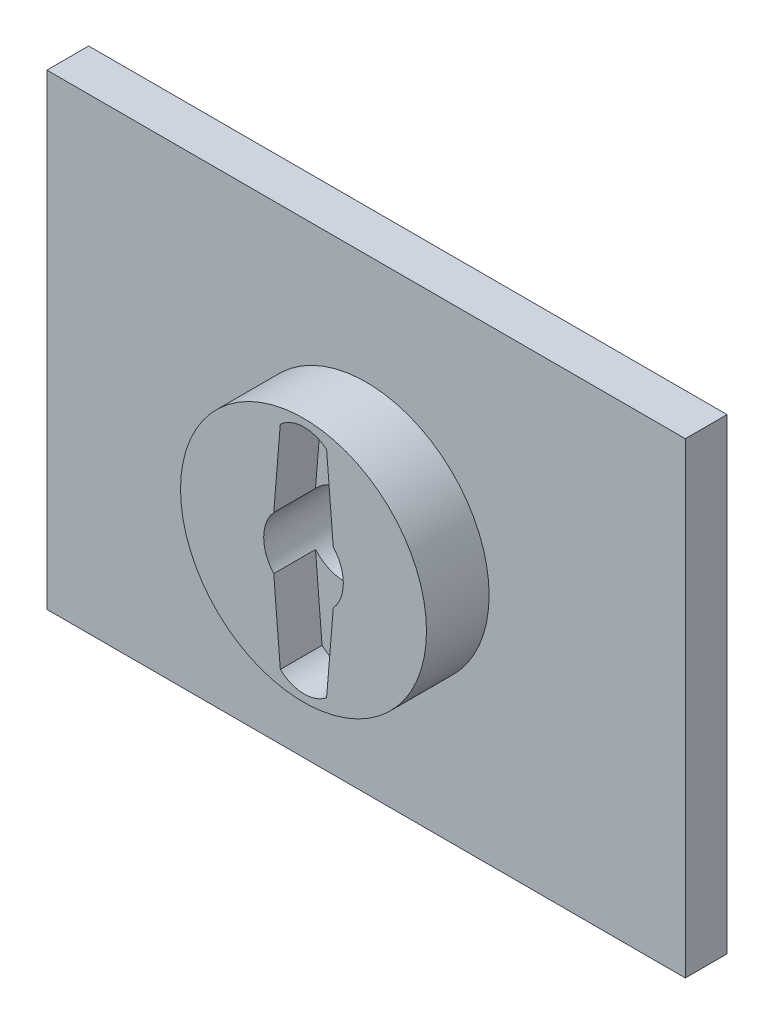
ISO-10303-21;
HEADER;
FILE_DESCRIPTION(('STEP AP214'),'2;1');
FILE_NAME('part.step','',(''),(''),'','','');
FILE_SCHEMA(('AUTOMOTIVE_DESIGN { 1 0 10303 214 1 1 1 1 }'));
ENDSEC;
DATA;
#1=APPLICATION_CONTEXT('core data for automotive mechanical design processes');
#2=APPLICATION_PROTOCOL_DEFINITION('international standard','automotive_design',2000,#1);
#3=PRODUCT_CONTEXT('',#1,'mechanical');
#4=PRODUCT('Part','Part','',(#3));
#5=PRODUCT_RELATED_PRODUCT_CATEGORY('part','',(#4));
#6=PRODUCT_DEFINITION_FORMATION('','',#4);
#7=PRODUCT_DEFINITION_CONTEXT('part definition',#1,'design');
#8=PRODUCT_DEFINITION('design','',#6,#7);
#9=PRODUCT_DEFINITION_SHAPE('','',#8);
#10=(LENGTH_UNIT() NAMED_UNIT(*) SI_UNIT(.MILLI.,.METRE.));
#11=(NAMED_UNIT(*) PLANE_ANGLE_UNIT() SI_UNIT($,.RADIAN.));
#12=(NAMED_UNIT(*) SI_UNIT($,.STERADIAN.) SOLID_ANGLE_UNIT());
#13=UNCERTAINTY_MEASURE_WITH_UNIT(LENGTH_MEASURE(1.E-05),#10,'distance_accuracy_value','');
#14=(GEOMETRIC_REPRESENTATION_CONTEXT(3) GLOBAL_UNCERTAINTY_ASSIGNED_CONTEXT((#13)) GLOBAL_UNIT_ASSIGNED_CONTEXT((#10,
#11,#12)) REPRESENTATION_CONTEXT('',''));
#15=CARTESIAN_POINT('',(0.,0.,0.));
#16=DIRECTION('',(0.,0.,1.));
#17=DIRECTION('',(1.,0.,0.));
#18=AXIS2_PLACEMENT_3D('',#15,#16,#17);
#19=CARTESIAN_POINT('',(-2.22302973270381,-10.1764153104196,6.));
#20=DIRECTION('',(-0.996638952948471,-0.0819194571867707,0.));
#21=DIRECTION('',(0.0819194571867707,-0.996638952948471,0.));
#22=AXIS2_PLACEMENT_3D('',#19,#20,#21);
#23=PLANE('',#22);
#24=DIRECTION('',(0.,0.,-1.));
#25=VECTOR('',#24,1.);
#26=CARTESIAN_POINT('',(-2.85106761194265,-2.53565405696655,10.));
#27=LINE('',#26,#25);
#28=CARTESIAN_POINT('',(-2.85106761194265,-2.53565405696655,10.));
#29=VERTEX_POINT('',#28);
#30=CARTESIAN_POINT('',(-2.85106761194265,-2.53565405696655,6.));
#31=VERTEX_POINT('',#30);
#32=EDGE_CURVE('E224',#29,#31,#27,.T.);
#33=ORIENTED_EDGE('',*,*,#32,.F.);
#34=DIRECTION('',(0.0819194571867707,-0.996638952948471,0.));
#35=VECTOR('',#34,1.);
#36=CARTESIAN_POINT('',(-2.22302973270381,-10.1764153104196,10.));
#37=LINE('',#36,#35);
#38=CARTESIAN_POINT('',(-2.22302973270381,-10.1764153104196,10.));
#39=VERTEX_POINT('',#38);
#40=EDGE_CURVE('E162',#29,#39,#37,.T.);
#41=ORIENTED_EDGE('',*,*,#40,.T.);
#42=DIRECTION('',(0.,0.,1.));
#43=VECTOR('',#42,1.);
#44=CARTESIAN_POINT('',(-2.22302973270381,-10.1764153104196,6.));
#45=LINE('',#44,#43);
#46=CARTESIAN_POINT('',(-2.22302973270381,-10.1764153104196,6.));
#47=VERTEX_POINT('',#46);
#48=EDGE_CURVE('E165',#47,#39,#45,.T.);
#49=ORIENTED_EDGE('',*,*,#48,.F.);
#50=DIRECTION('',(0.0819194571867707,-0.996638952948471,0.));
#51=VECTOR('',#50,1.);
#52=CARTESIAN_POINT('',(-2.22302973270381,-10.1764153104196,6.));
#53=LINE('',#52,#51);
#54=EDGE_CURVE('E174',#31,#47,#53,.T.);
#55=ORIENTED_EDGE('',*,*,#54,.F.);
#56=EDGE_LOOP('',(#33,#41,#49,#55));
#57=FACE_BOUND('',#56,.T.);
#58=ADVANCED_FACE('F39',(#57),#23,.F.);
#59=CARTESIAN_POINT('',(-2.22302973270416,10.1764153104192,6.));
#60=DIRECTION('',(-0.996638952948475,0.0819194571867297,0.));
#61=DIRECTION('',(-0.0819194571867297,-0.996638952948474,0.));
#62=AXIS2_PLACEMENT_3D('',#59,#60,#61);
#63=PLANE('',#62);
#64=DIRECTION('',(0.,0.,-1.));
#65=VECTOR('',#64,1.);
#66=CARTESIAN_POINT('',(-2.85106761194267,2.53565405696654,10.));
#67=LINE('',#66,#65);
#68=CARTESIAN_POINT('',(-2.85106761194266,2.53565405696654,6.));
#69=VERTEX_POINT('',#68);
#70=CARTESIAN_POINT('',(-2.85106761194266,2.53565405696654,10.));
#71=VERTEX_POINT('',#70);
#72=EDGE_CURVE('E144',#69,#71,#67,.F.);
#73=ORIENTED_EDGE('',*,*,#72,.F.);
#74=DIRECTION('',(-0.0819194571867297,-0.996638952948474,0.));
#75=VECTOR('',#74,1.);
#76=CARTESIAN_POINT('',(-2.22302973270416,10.1764153104192,6.));
#77=LINE('',#76,#75);
#78=CARTESIAN_POINT('',(-2.22302973270416,10.1764153104192,6.));
#79=VERTEX_POINT('',#78);
#80=EDGE_CURVE('E218',#79,#69,#77,.T.);
#81=ORIENTED_EDGE('',*,*,#80,.F.);
#82=DIRECTION('',(0.,0.,1.));
#83=VECTOR('',#82,1.);
#84=CARTESIAN_POINT('',(-2.22302973270416,10.1764153104192,6.));
#85=LINE('',#84,#83);
#86=CARTESIAN_POINT('',(-2.22302973270416,10.1764153104192,10.));
#87=VERTEX_POINT('',#86);
#88=EDGE_CURVE('E168',#79,#87,#85,.T.);
#89=ORIENTED_EDGE('',*,*,#88,.T.);
#90=DIRECTION('',(-0.0819194571867297,-0.996638952948474,0.));
#91=VECTOR('',#90,1.);
#92=CARTESIAN_POINT('',(-2.22302973270416,10.1764153104192,10.));
#93=LINE('',#92,#91);
#94=EDGE_CURVE('E155',#87,#71,#93,.T.);
#95=ORIENTED_EDGE('',*,*,#94,.T.);
#96=EDGE_LOOP('',(#73,#81,#89,#95));
#97=FACE_BOUND('',#96,.T.);
#98=ADVANCED_FACE('F222',(#97),#63,.F.);
#99=CARTESIAN_POINT('',(2.87019869043233,2.30290425128261,6.));
#100=DIRECTION('',(0.996638994593508,0.0819189505282011,0.));
#101=DIRECTION('',(-0.0819189505282012,0.996638994593508,0.));
#102=AXIS2_PLACEMENT_3D('',#99,#100,#101);
#103=PLANE('',#102);
#104=DIRECTION('',(0.,0.,-1.));
#105=VECTOR('',#104,1.);
#106=CARTESIAN_POINT('',(2.85106778774022,2.53565385930127,10.));
#107=LINE('',#106,#105);
#108=CARTESIAN_POINT('',(2.85106778774022,2.53565385930127,10.));
#109=VERTEX_POINT('',#108);
#110=CARTESIAN_POINT('',(2.85106778774021,2.53565385930127,6.));
#111=VERTEX_POINT('',#110);
#112=EDGE_CURVE('E54',#109,#111,#107,.T.);
#113=ORIENTED_EDGE('',*,*,#112,.F.);
#114=DIRECTION('',(-0.0819189505282011,0.996638994593508,0.));
#115=VECTOR('',#114,1.);
#116=CARTESIAN_POINT('',(2.87019869043233,2.30290425128261,10.));
#117=LINE('',#116,#115);
#118=CARTESIAN_POINT('',(2.21231952309608,10.3067669432527,10.));
#119=VERTEX_POINT('',#118);
#120=EDGE_CURVE('E141',#109,#119,#117,.T.);
#121=ORIENTED_EDGE('',*,*,#120,.T.);
#122=DIRECTION('',(0.,0.,1.));
#123=VECTOR('',#122,1.);
#124=CARTESIAN_POINT('',(2.21231952309608,10.3067669432527,6.));
#125=LINE('',#124,#123);
#126=CARTESIAN_POINT('',(2.21231952309608,10.3067669432527,6.));
#127=VERTEX_POINT('',#126);
#128=EDGE_CURVE('E170',#127,#119,#125,.T.);
#129=ORIENTED_EDGE('',*,*,#128,.F.);
#130=DIRECTION('',(-0.0819189505282011,0.996638994593508,0.));
#131=VECTOR('',#130,1.);
#132=CARTESIAN_POINT('',(2.87019869043233,2.30290425128261,6.));
#133=LINE('',#132,#131);
#134=EDGE_CURVE('E143',#111,#127,#133,.T.);
#135=ORIENTED_EDGE('',*,*,#134,.F.);
#136=EDGE_LOOP('',(#113,#121,#129,#135));
#137=FACE_BOUND('',#136,.T.);
#138=ADVANCED_FACE('F139',(#137),#103,.F.);
#139=CARTESIAN_POINT('',(2.87019869043233,-2.3029042512826,6.));
#140=DIRECTION('',(0.996638994593509,-0.0819189505281875,0.));
#141=DIRECTION('',(0.0819189505281875,0.996638994593509,0.));
#142=AXIS2_PLACEMENT_3D('',#139,#140,#141);
#143=PLANE('',#142);
#144=DIRECTION('',(0.,0.,-1.));
#145=VECTOR('',#144,1.);
#146=CARTESIAN_POINT('',(2.85106778774022,-2.53565385930126,10.));
#147=LINE('',#146,#145);
#148=CARTESIAN_POINT('',(2.85106778774022,-2.53565385930126,6.));
#149=VERTEX_POINT('',#148);
#150=CARTESIAN_POINT('',(2.85106778774022,-2.53565385930126,10.));
#151=VERTEX_POINT('',#150);
#152=EDGE_CURVE('E130',#149,#151,#147,.F.);
#153=ORIENTED_EDGE('',*,*,#152,.F.);
#154=DIRECTION('',(0.0819189505281875,0.996638994593509,0.));
#155=VECTOR('',#154,1.);
#156=CARTESIAN_POINT('',(2.87019869043233,-2.3029042512826,6.));
#157=LINE('',#156,#155);
#158=CARTESIAN_POINT('',(2.2123195230962,-10.3067669432526,6.));
#159=VERTEX_POINT('',#158);
#160=EDGE_CURVE('E230',#159,#149,#157,.T.);
#161=ORIENTED_EDGE('',*,*,#160,.F.);
#162=DIRECTION('',(0.,0.,1.));
#163=VECTOR('',#162,1.);
#164=CARTESIAN_POINT('',(2.2123195230962,-10.3067669432526,6.));
#165=LINE('',#164,#163);
#166=CARTESIAN_POINT('',(2.2123195230962,-10.3067669432526,10.));
#167=VERTEX_POINT('',#166);
#168=EDGE_CURVE('E172',#159,#167,#165,.T.);
#169=ORIENTED_EDGE('',*,*,#168,.T.);
#170=DIRECTION('',(0.0819189505281875,0.996638994593509,0.));
#171=VECTOR('',#170,1.);
#172=CARTESIAN_POINT('',(2.87019869043233,-2.3029042512826,10.));
#173=LINE('',#172,#171);
#174=EDGE_CURVE('E153',#167,#151,#173,.T.);
#175=ORIENTED_EDGE('',*,*,#174,.T.);
#176=EDGE_LOOP('',(#153,#161,#169,#175));
#177=FACE_BOUND('',#176,.T.);
#178=ADVANCED_FACE('F247',(#177),#143,.F.);
#179=CARTESIAN_POINT('',(0.0695936137938072,-7.69138338466831,6.));
#180=DIRECTION('',(0.,0.,1.));
#181=DIRECTION('',(1.,0.,0.));
#182=AXIS2_PLACEMENT_3D('',#179,#180,#181);
#183=PLANE('',#182);
#184=ORIENTED_EDGE('',*,*,#160,.T.);
#185=CARTESIAN_POINT('',(0.,0.,6.));
#186=DIRECTION('',(0.,0.,1.));
#187=DIRECTION('',(1.,0.,0.));
#188=AXIS2_PLACEMENT_3D('',#185,#186,#187);
#189=CIRCLE('',#188,3.81551150233875);
#190=EDGE_CURVE('E11',#149,#31,#189,.F.);
#191=ORIENTED_EDGE('',*,*,#190,.T.);
#192=ORIENTED_EDGE('',*,*,#54,.T.);
#193=CARTESIAN_POINT('',(0.0695936137938072,-7.69138338466831,6.));
#194=DIRECTION('',(0.,0.,1.));
#195=DIRECTION('',(1.,0.,0.));
#196=AXIS2_PLACEMENT_3D('',#193,#194,#195);
#197=CIRCLE('',#196,3.38105094325846);
#198=EDGE_CURVE('E164',#47,#159,#197,.T.);
#199=ORIENTED_EDGE('',*,*,#198,.T.);
#200=EDGE_LOOP('',(#184,#191,#192,#199));
#201=FACE_BOUND('',#200,.T.);
#202=ADVANCED_FACE('F240',(#201),#183,.T.);
#203=CARTESIAN_POINT('',(0.,0.,4.));
#204=DIRECTION('',(0.,0.,-1.));
#205=DIRECTION('',(-1.,0.,0.));
#206=AXIS2_PLACEMENT_3D('',#203,#204,#205);
#207=PLANE('',#206);
#208=CARTESIAN_POINT('',(0.,0.,4.));
#209=DIRECTION('',(0.,0.,-1.));
#210=DIRECTION('',(-1.,0.,0.));
#211=AXIS2_PLACEMENT_3D('',#208,#209,#210);
#212=CIRCLE('',#211,11.7834634649906);
#213=CARTESIAN_POINT('',(-11.7834634649906,0.,4.));
#214=VERTEX_POINT('',#213);
#215=EDGE_CURVE('E209',#214,#214,#212,.F.);
#216=ORIENTED_EDGE('',*,*,#215,.F.);
#217=EDGE_LOOP('',(#216));
#218=FACE_BOUND('',#217,.T.);
#219=DIRECTION('',(0.,1.,0.));
#220=VECTOR('',#219,1.);
#221=CARTESIAN_POINT('',(30.5844999291003,22.3759992420673,4.));
#222=LINE('',#221,#220);
#223=CARTESIAN_POINT('',(30.5844999291003,-22.3759992420673,4.));
#224=VERTEX_POINT('',#223);
#225=CARTESIAN_POINT('',(30.5844999291003,22.3759992420673,4.));
#226=VERTEX_POINT('',#225);
#227=EDGE_CURVE('E181',#224,#226,#222,.T.);
#228=ORIENTED_EDGE('',*,*,#227,.T.);
#229=DIRECTION('',(-1.,0.,0.));
#230=VECTOR('',#229,1.);
#231=CARTESIAN_POINT('',(30.5844999291003,22.3759992420673,4.));
#232=LINE('',#231,#230);
#233=CARTESIAN_POINT('',(-30.5844999291003,22.3759992420673,4.));
#234=VERTEX_POINT('',#233);
#235=EDGE_CURVE('E184',#226,#234,#232,.T.);
#236=ORIENTED_EDGE('',*,*,#235,.T.);
#237=DIRECTION('',(0.,-1.,0.));
#238=VECTOR('',#237,1.);
#239=CARTESIAN_POINT('',(-30.5844999291003,22.3759992420673,4.));
#240=LINE('',#239,#238);
#241=CARTESIAN_POINT('',(-30.5844999291003,-22.3759992420673,4.));
#242=VERTEX_POINT('',#241);
#243=EDGE_CURVE('E187',#234,#242,#240,.T.);
#244=ORIENTED_EDGE('',*,*,#243,.T.);
#245=DIRECTION('',(1.,0.,0.));
#246=VECTOR('',#245,1.);
#247=CARTESIAN_POINT('',(30.5844999291003,-22.3759992420673,4.));
#248=LINE('',#247,#246);
#249=EDGE_CURVE('E189',#242,#224,#248,.T.);
#250=ORIENTED_EDGE('',*,*,#249,.T.);
#251=EDGE_LOOP('',(#228,#236,#244,#250));
#252=FACE_BOUND('',#251,.T.);
#253=ADVANCED_FACE('F254',(#218,#252),#207,.F.);
#254=CARTESIAN_POINT('',(0.,0.,0.));
#255=DIRECTION('',(0.,0.,-1.));
#256=DIRECTION('',(-1.,0.,0.));
#257=AXIS2_PLACEMENT_3D('',#254,#255,#256);
#258=PLANE('',#257);
#259=DIRECTION('',(0.,1.,0.));
#260=VECTOR('',#259,1.);
#261=CARTESIAN_POINT('',(30.5844999291003,22.3759992420673,0.));
#262=LINE('',#261,#260);
#263=CARTESIAN_POINT('',(30.5844999291003,-22.3759992420673,0.));
#264=VERTEX_POINT('',#263);
#265=CARTESIAN_POINT('',(30.5844999291003,22.3759992420673,0.));
#266=VERTEX_POINT('',#265);
#267=EDGE_CURVE('E180',#264,#266,#262,.T.);
#268=ORIENTED_EDGE('',*,*,#267,.F.);
#269=DIRECTION('',(1.,0.,0.));
#270=VECTOR('',#269,1.);
#271=CARTESIAN_POINT('',(30.5844999291003,-22.3759992420673,0.));
#272=LINE('',#271,#270);
#273=CARTESIAN_POINT('',(-30.5844999291003,-22.3759992420673,0.));
#274=VERTEX_POINT('',#273);
#275=EDGE_CURVE('E185',#274,#264,#272,.T.);
#276=ORIENTED_EDGE('',*,*,#275,.F.);
#277=DIRECTION('',(0.,-1.,0.));
#278=VECTOR('',#277,1.);
#279=CARTESIAN_POINT('',(-30.5844999291003,22.3759992420673,0.));
#280=LINE('',#279,#278);
#281=CARTESIAN_POINT('',(-30.5844999291003,22.3759992420673,0.));
#282=VERTEX_POINT('',#281);
#283=EDGE_CURVE('E196',#282,#274,#280,.T.);
#284=ORIENTED_EDGE('',*,*,#283,.F.);
#285=DIRECTION('',(-1.,0.,0.));
#286=VECTOR('',#285,1.);
#287=CARTESIAN_POINT('',(30.5844999291003,22.3759992420673,0.));
#288=LINE('',#287,#286);
#289=EDGE_CURVE('E194',#266,#282,#288,.T.);
#290=ORIENTED_EDGE('',*,*,#289,.F.);
#291=EDGE_LOOP('',(#268,#276,#284,#290));
#292=FACE_BOUND('',#291,.T.);
#293=CARTESIAN_POINT('',(0.,0.,0.));
#294=DIRECTION('',(0.,0.,1.));
#295=DIRECTION('',(1.,0.,0.));
#296=AXIS2_PLACEMENT_3D('',#293,#294,#295);
#297=CIRCLE('',#296,3.81551150233875);
#298=CARTESIAN_POINT('',(3.81551150233875,0.,0.));
#299=VERTEX_POINT('',#298);
#300=EDGE_CURVE('E177',#299,#299,#297,.T.);
#301=ORIENTED_EDGE('',*,*,#300,.T.);
#302=EDGE_LOOP('',(#301));
#303=FACE_BOUND('',#302,.T.);
#304=ADVANCED_FACE('F288',(#292,#303),#258,.T.);
#305=CARTESIAN_POINT('',(30.5844999291003,22.3759992420673,4.));
#306=DIRECTION('',(-1.,0.,0.));
#307=DIRECTION('',(0.,0.,1.));
#308=AXIS2_PLACEMENT_3D('',#305,#306,#307);
#309=PLANE('',#308);
#310=ORIENTED_EDGE('',*,*,#267,.T.);
#311=DIRECTION('',(0.,0.,-1.));
#312=VECTOR('',#311,1.);
#313=CARTESIAN_POINT('',(30.5844999291003,22.3759992420673,4.));
#314=LINE('',#313,#312);
#315=EDGE_CURVE('E207',#226,#266,#314,.T.);
#316=ORIENTED_EDGE('',*,*,#315,.F.);
#317=ORIENTED_EDGE('',*,*,#227,.F.);
#318=DIRECTION('',(0.,0.,-1.));
#319=VECTOR('',#318,1.);
#320=CARTESIAN_POINT('',(30.5844999291003,-22.3759992420673,4.));
#321=LINE('',#320,#319);
#322=EDGE_CURVE('E191',#224,#264,#321,.T.);
#323=ORIENTED_EDGE('',*,*,#322,.T.);
#324=EDGE_LOOP('',(#310,#316,#317,#323));
#325=FACE_BOUND('',#324,.T.);
#326=ADVANCED_FACE('F41',(#325),#309,.F.);
#327=CARTESIAN_POINT('',(30.5844999291003,22.3759992420673,4.));
#328=DIRECTION('',(0.,-1.,0.));
#329=DIRECTION('',(0.,0.,-1.));
#330=AXIS2_PLACEMENT_3D('',#327,#328,#329);
#331=PLANE('',#330);
#332=ORIENTED_EDGE('',*,*,#289,.T.);
#333=DIRECTION('',(0.,0.,-1.));
#334=VECTOR('',#333,1.);
#335=CARTESIAN_POINT('',(-30.5844999291003,22.3759992420673,4.));
#336=LINE('',#335,#334);
#337=EDGE_CURVE('E204',#234,#282,#336,.T.);
#338=ORIENTED_EDGE('',*,*,#337,.F.);
#339=ORIENTED_EDGE('',*,*,#235,.F.);
#340=ORIENTED_EDGE('',*,*,#315,.T.);
#341=EDGE_LOOP('',(#332,#338,#339,#340));
#342=FACE_BOUND('',#341,.T.);
#343=ADVANCED_FACE('F298',(#342),#331,.F.);
#344=CARTESIAN_POINT('',(-30.5844999291003,22.3759992420673,4.));
#345=DIRECTION('',(1.,0.,0.));
#346=DIRECTION('',(0.,0.,-1.));
#347=AXIS2_PLACEMENT_3D('',#344,#345,#346);
#348=PLANE('',#347);
#349=ORIENTED_EDGE('',*,*,#283,.T.);
#350=DIRECTION('',(0.,0.,-1.));
#351=VECTOR('',#350,1.);
#352=CARTESIAN_POINT('',(-30.5844999291003,-22.3759992420673,4.));
#353=LINE('',#352,#351);
#354=EDGE_CURVE('E201',#242,#274,#353,.T.);
#355=ORIENTED_EDGE('',*,*,#354,.F.);
#356=ORIENTED_EDGE('',*,*,#243,.F.);
#357=ORIENTED_EDGE('',*,*,#337,.T.);
#358=EDGE_LOOP('',(#349,#355,#356,#357));
#359=FACE_BOUND('',#358,.T.);
#360=ADVANCED_FACE('F295',(#359),#348,.F.);
#361=CARTESIAN_POINT('',(30.5844999291003,-22.3759992420673,4.));
#362=DIRECTION('',(0.,1.,0.));
#363=DIRECTION('',(0.,0.,1.));
#364=AXIS2_PLACEMENT_3D('',#361,#362,#363);
#365=PLANE('',#364);
#366=ORIENTED_EDGE('',*,*,#275,.T.);
#367=ORIENTED_EDGE('',*,*,#322,.F.);
#368=ORIENTED_EDGE('',*,*,#249,.F.);
#369=ORIENTED_EDGE('',*,*,#354,.T.);
#370=EDGE_LOOP('',(#366,#367,#368,#369));
#371=FACE_BOUND('',#370,.T.);
#372=ADVANCED_FACE('F284',(#371),#365,.F.);
#373=CARTESIAN_POINT('',(0.,0.,4.));
#374=DIRECTION('',(0.,0.,-1.));
#375=DIRECTION('',(-1.,0.,0.));
#376=AXIS2_PLACEMENT_3D('',#373,#374,#375);
#377=CYLINDRICAL_SURFACE('',#376,3.81551150233875);
#378=ORIENTED_EDGE('',*,*,#300,.F.);
#379=EDGE_LOOP('',(#378));
#380=FACE_BOUND('',#379,.T.);
#381=ORIENTED_EDGE('',*,*,#32,.T.);
#382=ORIENTED_EDGE('',*,*,#190,.F.);
#383=ORIENTED_EDGE('',*,*,#152,.T.);
#384=CARTESIAN_POINT('',(0.,0.,10.));
#385=DIRECTION('',(0.,0.,1.));
#386=DIRECTION('',(1.,0.,0.));
#387=AXIS2_PLACEMENT_3D('',#384,#385,#386);
#388=CIRCLE('',#387,3.81551150233875);
#389=EDGE_CURVE('E127',#151,#109,#388,.T.);
#390=ORIENTED_EDGE('',*,*,#389,.T.);
#391=ORIENTED_EDGE('',*,*,#112,.T.);
#392=EDGE_CURVE('E43',#69,#111,#189,.F.);
#393=ORIENTED_EDGE('',*,*,#392,.F.);
#394=ORIENTED_EDGE('',*,*,#72,.T.);
#395=EDGE_CURVE('E135',#71,#29,#388,.T.);
#396=ORIENTED_EDGE('',*,*,#395,.T.);
#397=EDGE_LOOP('',(#381,#382,#383,#390,#391,#393,#394,#396));
#398=FACE_BOUND('',#397,.T.);
#399=ADVANCED_FACE('F128',(#380,#398),#377,.F.);
#400=CARTESIAN_POINT('',(0.,0.,10.));
#401=DIRECTION('',(0.,0.,-1.));
#402=DIRECTION('',(-1.,0.,0.));
#403=AXIS2_PLACEMENT_3D('',#400,#401,#402);
#404=CYLINDRICAL_SURFACE('',#403,11.7834634649906);
#405=CARTESIAN_POINT('',(0.,0.,10.));
#406=DIRECTION('',(0.,0.,1.));
#407=DIRECTION('',(1.,0.,0.));
#408=AXIS2_PLACEMENT_3D('',#405,#406,#407);
#409=CIRCLE('',#408,11.7834634649906);
#410=CARTESIAN_POINT('',(11.7834634649906,0.,10.));
#411=VERTEX_POINT('',#410);
#412=EDGE_CURVE('E167',#411,#411,#409,.T.);
#413=ORIENTED_EDGE('',*,*,#412,.F.);
#414=EDGE_LOOP('',(#413));
#415=FACE_BOUND('',#414,.T.);
#416=ORIENTED_EDGE('',*,*,#215,.T.);
#417=EDGE_LOOP('',(#416));
#418=FACE_BOUND('',#417,.T.);
#419=ADVANCED_FACE('F277',(#415,#418),#404,.T.);
#420=CARTESIAN_POINT('',(0.,0.,10.));
#421=DIRECTION('',(0.,0.,1.));
#422=DIRECTION('',(1.,0.,0.));
#423=AXIS2_PLACEMENT_3D('',#420,#421,#422);
#424=PLANE('',#423);
#425=ORIENTED_EDGE('',*,*,#40,.F.);
#426=ORIENTED_EDGE('',*,*,#395,.F.);
#427=ORIENTED_EDGE('',*,*,#94,.F.);
#428=CARTESIAN_POINT('',(0.0695936137938072,7.6913833846683,10.));
#429=DIRECTION('',(0.,0.,1.));
#430=DIRECTION('',(-1.,0.,0.));
#431=AXIS2_PLACEMENT_3D('',#428,#429,#430);
#432=CIRCLE('',#431,3.38105094325846);
#433=EDGE_CURVE('E152',#119,#87,#432,.T.);
#434=ORIENTED_EDGE('',*,*,#433,.F.);
#435=ORIENTED_EDGE('',*,*,#120,.F.);
#436=ORIENTED_EDGE('',*,*,#389,.F.);
#437=ORIENTED_EDGE('',*,*,#174,.F.);
#438=CARTESIAN_POINT('',(0.0695936137938072,-7.69138338466831,10.));
#439=DIRECTION('',(0.,0.,1.));
#440=DIRECTION('',(1.,0.,0.));
#441=AXIS2_PLACEMENT_3D('',#438,#439,#440);
#442=CIRCLE('',#441,3.38105094325846);
#443=EDGE_CURVE('E62',#39,#167,#442,.T.);
#444=ORIENTED_EDGE('',*,*,#443,.F.);
#445=EDGE_LOOP('',(#425,#426,#427,#434,#435,#436,#437,#444));
#446=FACE_BOUND('',#445,.T.);
#447=ORIENTED_EDGE('',*,*,#412,.T.);
#448=EDGE_LOOP('',(#447));
#449=FACE_BOUND('',#448,.T.);
#450=ADVANCED_FACE('F148',(#446,#449),#424,.T.);
#451=CARTESIAN_POINT('',(0.0695936137938072,-7.69138338466831,6.));
#452=DIRECTION('',(0.,0.,1.));
#453=DIRECTION('',(1.,0.,0.));
#454=AXIS2_PLACEMENT_3D('',#451,#452,#453);
#455=CYLINDRICAL_SURFACE('',#454,3.38105094325846);
#456=ORIENTED_EDGE('',*,*,#443,.T.);
#457=ORIENTED_EDGE('',*,*,#168,.F.);
#458=ORIENTED_EDGE('',*,*,#198,.F.);
#459=ORIENTED_EDGE('',*,*,#48,.T.);
#460=EDGE_LOOP('',(#456,#457,#458,#459));
#461=FACE_BOUND('',#460,.T.);
#462=ADVANCED_FACE('F244',(#461),#455,.F.);
#463=CARTESIAN_POINT('',(0.0695936137938072,7.6913833846683,6.));
#464=DIRECTION('',(0.,0.,1.));
#465=DIRECTION('',(1.,0.,0.));
#466=AXIS2_PLACEMENT_3D('',#463,#464,#465);
#467=CYLINDRICAL_SURFACE('',#466,3.38105094325846);
#468=ORIENTED_EDGE('',*,*,#433,.T.);
#469=ORIENTED_EDGE('',*,*,#88,.F.);
#470=CARTESIAN_POINT('',(0.0695936137938072,7.6913833846683,6.));
#471=DIRECTION('',(0.,0.,1.));
#472=DIRECTION('',(-1.,0.,0.));
#473=AXIS2_PLACEMENT_3D('',#470,#471,#472);
#474=CIRCLE('',#473,3.38105094325846);
#475=EDGE_CURVE('E234',#127,#79,#474,.T.);
#476=ORIENTED_EDGE('',*,*,#475,.F.);
#477=ORIENTED_EDGE('',*,*,#128,.T.);
#478=EDGE_LOOP('',(#468,#469,#476,#477));
#479=FACE_BOUND('',#478,.T.);
#480=ADVANCED_FACE('F266',(#479),#467,.F.);
#481=ORIENTED_EDGE('',*,*,#80,.T.);
#482=ORIENTED_EDGE('',*,*,#392,.T.);
#483=ORIENTED_EDGE('',*,*,#134,.T.);
#484=ORIENTED_EDGE('',*,*,#475,.T.);
#485=EDGE_LOOP('',(#481,#482,#483,#484));
#486=FACE_BOUND('',#485,.T.);
#487=ADVANCED_FACE('F215',(#486),#183,.T.);
#488=CLOSED_SHELL('',(#58,#98,#138,#178,#202,#253,#304,#326,#343,#360,#372,#399,#419,#450,#462,
#480,#487));
#489=MANIFOLD_SOLID_BREP('B2',#488);
#490=ADVANCED_BREP_SHAPE_REPRESENTATION('',(#18,#489),#14);
#491=SHAPE_DEFINITION_REPRESENTATION(#9,#490);
ENDSEC;
END-ISO-10303-21;
